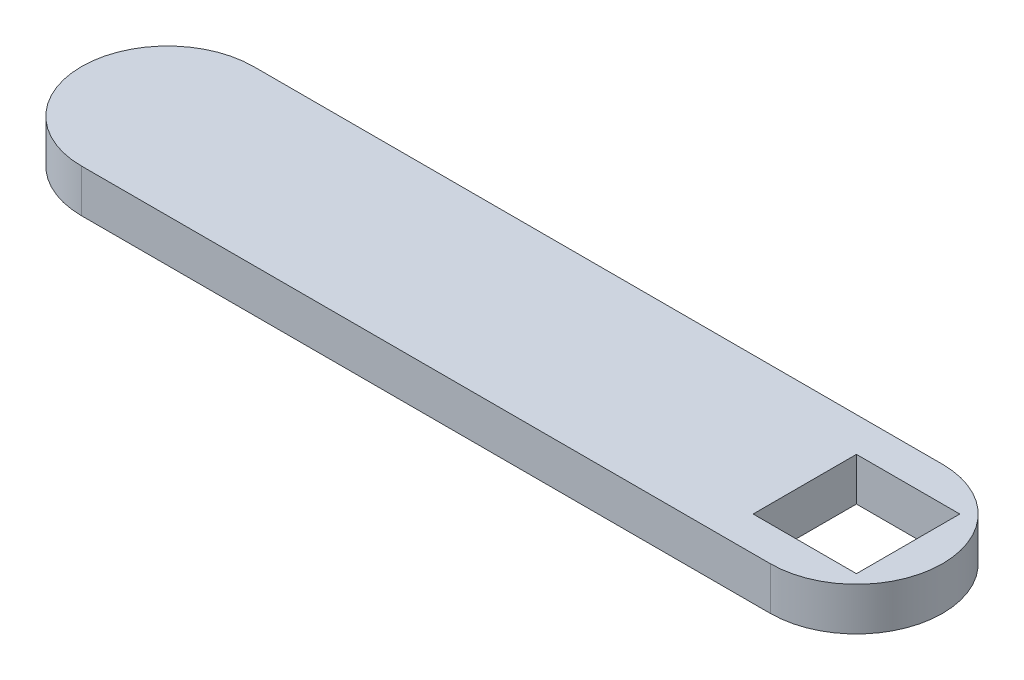
ISO-10303-21;
HEADER;
FILE_DESCRIPTION(('STEP AP214'),'2;1');
FILE_NAME('part.step','',(''),(''),'','','');
FILE_SCHEMA(('AUTOMOTIVE_DESIGN { 1 0 10303 214 1 1 1 1 }'));
ENDSEC;
DATA;
#1=APPLICATION_CONTEXT('core data for automotive mechanical design processes');
#2=APPLICATION_PROTOCOL_DEFINITION('international standard','automotive_design',2000,#1);
#3=PRODUCT_CONTEXT('',#1,'mechanical');
#4=PRODUCT('Part','Part','',(#3));
#5=PRODUCT_RELATED_PRODUCT_CATEGORY('part','',(#4));
#6=PRODUCT_DEFINITION_FORMATION('','',#4);
#7=PRODUCT_DEFINITION_CONTEXT('part definition',#1,'design');
#8=PRODUCT_DEFINITION('design','',#6,#7);
#9=PRODUCT_DEFINITION_SHAPE('','',#8);
#10=(LENGTH_UNIT() NAMED_UNIT(*) SI_UNIT(.MILLI.,.METRE.));
#11=(NAMED_UNIT(*) PLANE_ANGLE_UNIT() SI_UNIT($,.RADIAN.));
#12=(NAMED_UNIT(*) SI_UNIT($,.STERADIAN.) SOLID_ANGLE_UNIT());
#13=UNCERTAINTY_MEASURE_WITH_UNIT(LENGTH_MEASURE(1.E-05),#10,'distance_accuracy_value','');
#14=(GEOMETRIC_REPRESENTATION_CONTEXT(3) GLOBAL_UNCERTAINTY_ASSIGNED_CONTEXT((#13)) GLOBAL_UNIT_ASSIGNED_CONTEXT((#10,
#11,#12)) REPRESENTATION_CONTEXT('',''));
#15=CARTESIAN_POINT('',(0.,0.,0.));
#16=DIRECTION('',(0.,0.,1.));
#17=DIRECTION('',(1.,0.,0.));
#18=AXIS2_PLACEMENT_3D('',#15,#16,#17);
#19=CARTESIAN_POINT('',(0.,25.,0.));
#20=DIRECTION('',(0.,-1.,0.));
#21=DIRECTION('',(0.,0.,-1.));
#22=AXIS2_PLACEMENT_3D('',#19,#20,#21);
#23=CYLINDRICAL_SURFACE('',#22,50.);
#24=CARTESIAN_POINT('',(0.,0.,0.));
#25=DIRECTION('',(0.,1.,0.));
#26=DIRECTION('',(0.,0.,1.));
#27=AXIS2_PLACEMENT_3D('',#24,#25,#26);
#28=CIRCLE('',#27,50.);
#29=CARTESIAN_POINT('',(0.,0.,-50.));
#30=VERTEX_POINT('',#29);
#31=CARTESIAN_POINT('',(0.,0.,50.));
#32=VERTEX_POINT('',#31);
#33=EDGE_CURVE('E151',#30,#32,#28,.T.);
#34=ORIENTED_EDGE('',*,*,#33,.T.);
#35=DIRECTION('',(0.,-1.,0.));
#36=VECTOR('',#35,1.);
#37=CARTESIAN_POINT('',(0.,25.,50.));
#38=LINE('',#37,#36);
#39=CARTESIAN_POINT('',(0.,25.,50.));
#40=VERTEX_POINT('',#39);
#41=EDGE_CURVE('E11',#40,#32,#38,.T.);
#42=ORIENTED_EDGE('',*,*,#41,.F.);
#43=CARTESIAN_POINT('',(0.,25.,0.));
#44=DIRECTION('',(0.,1.,0.));
#45=DIRECTION('',(0.,0.,1.));
#46=AXIS2_PLACEMENT_3D('',#43,#44,#45);
#47=CIRCLE('',#46,50.);
#48=CARTESIAN_POINT('',(0.,25.,-50.));
#49=VERTEX_POINT('',#48);
#50=EDGE_CURVE('E157',#49,#40,#47,.T.);
#51=ORIENTED_EDGE('',*,*,#50,.F.);
#52=DIRECTION('',(0.,-1.,0.));
#53=VECTOR('',#52,1.);
#54=CARTESIAN_POINT('',(0.,25.,-50.));
#55=LINE('',#54,#53);
#56=EDGE_CURVE('E171',#49,#30,#55,.T.);
#57=ORIENTED_EDGE('',*,*,#56,.T.);
#58=EDGE_LOOP('',(#34,#42,#51,#57));
#59=FACE_BOUND('',#58,.T.);
#60=ADVANCED_FACE('F43',(#59),#23,.T.);
#61=CARTESIAN_POINT('',(0.,25.,50.));
#62=DIRECTION('',(0.,0.,-1.));
#63=DIRECTION('',(-1.,0.,0.));
#64=AXIS2_PLACEMENT_3D('',#61,#62,#63);
#65=PLANE('',#64);
#66=DIRECTION('',(1.,0.,0.));
#67=VECTOR('',#66,1.);
#68=CARTESIAN_POINT('',(0.,0.,50.));
#69=LINE('',#68,#67);
#70=CARTESIAN_POINT('',(400.,0.,50.));
#71=VERTEX_POINT('',#70);
#72=EDGE_CURVE('E175',#32,#71,#69,.T.);
#73=ORIENTED_EDGE('',*,*,#72,.T.);
#74=DIRECTION('',(0.,-1.,0.));
#75=VECTOR('',#74,1.);
#76=CARTESIAN_POINT('',(400.,25.,50.));
#77=LINE('',#76,#75);
#78=CARTESIAN_POINT('',(400.,25.,50.));
#79=VERTEX_POINT('',#78);
#80=EDGE_CURVE('E51',#79,#71,#77,.T.);
#81=ORIENTED_EDGE('',*,*,#80,.F.);
#82=DIRECTION('',(1.,0.,0.));
#83=VECTOR('',#82,1.);
#84=CARTESIAN_POINT('',(0.,25.,50.));
#85=LINE('',#84,#83);
#86=EDGE_CURVE('E161',#40,#79,#85,.T.);
#87=ORIENTED_EDGE('',*,*,#86,.F.);
#88=ORIENTED_EDGE('',*,*,#41,.T.);
#89=EDGE_LOOP('',(#73,#81,#87,#88));
#90=FACE_BOUND('',#89,.T.);
#91=ADVANCED_FACE('F209',(#90),#65,.F.);
#92=CARTESIAN_POINT('',(400.,25.,0.));
#93=DIRECTION('',(0.,-1.,0.));
#94=DIRECTION('',(0.,0.,-1.));
#95=AXIS2_PLACEMENT_3D('',#92,#93,#94);
#96=CYLINDRICAL_SURFACE('',#95,50.);
#97=CARTESIAN_POINT('',(400.,0.,0.));
#98=DIRECTION('',(0.,1.,0.));
#99=DIRECTION('',(0.,0.,1.));
#100=AXIS2_PLACEMENT_3D('',#97,#98,#99);
#101=CIRCLE('',#100,50.);
#102=CARTESIAN_POINT('',(400.,0.,-50.));
#103=VERTEX_POINT('',#102);
#104=EDGE_CURVE('E178',#71,#103,#101,.T.);
#105=ORIENTED_EDGE('',*,*,#104,.T.);
#106=DIRECTION('',(0.,-1.,0.));
#107=VECTOR('',#106,1.);
#108=CARTESIAN_POINT('',(400.,25.,-50.));
#109=LINE('',#108,#107);
#110=CARTESIAN_POINT('',(400.,25.,-50.));
#111=VERTEX_POINT('',#110);
#112=EDGE_CURVE('E186',#111,#103,#109,.T.);
#113=ORIENTED_EDGE('',*,*,#112,.F.);
#114=CARTESIAN_POINT('',(400.,25.,0.));
#115=DIRECTION('',(0.,1.,0.));
#116=DIRECTION('',(0.,0.,1.));
#117=AXIS2_PLACEMENT_3D('',#114,#115,#116);
#118=CIRCLE('',#117,50.);
#119=EDGE_CURVE('E165',#79,#111,#118,.T.);
#120=ORIENTED_EDGE('',*,*,#119,.F.);
#121=ORIENTED_EDGE('',*,*,#80,.T.);
#122=EDGE_LOOP('',(#105,#113,#120,#121));
#123=FACE_BOUND('',#122,.T.);
#124=ADVANCED_FACE('F195',(#123),#96,.T.);
#125=CARTESIAN_POINT('',(0.,25.,-50.));
#126=DIRECTION('',(0.,0.,1.));
#127=DIRECTION('',(1.,0.,0.));
#128=AXIS2_PLACEMENT_3D('',#125,#126,#127);
#129=PLANE('',#128);
#130=DIRECTION('',(-1.,0.,0.));
#131=VECTOR('',#130,1.);
#132=CARTESIAN_POINT('',(0.,0.,-50.));
#133=LINE('',#132,#131);
#134=EDGE_CURVE('E162',#103,#30,#133,.T.);
#135=ORIENTED_EDGE('',*,*,#134,.T.);
#136=ORIENTED_EDGE('',*,*,#56,.F.);
#137=DIRECTION('',(-1.,0.,0.));
#138=VECTOR('',#137,1.);
#139=CARTESIAN_POINT('',(0.,25.,-50.));
#140=LINE('',#139,#138);
#141=EDGE_CURVE('E168',#111,#49,#140,.T.);
#142=ORIENTED_EDGE('',*,*,#141,.F.);
#143=ORIENTED_EDGE('',*,*,#112,.T.);
#144=EDGE_LOOP('',(#135,#136,#142,#143));
#145=FACE_BOUND('',#144,.T.);
#146=ADVANCED_FACE('F202',(#145),#129,.F.);
#147=CARTESIAN_POINT('',(0.,25.,0.));
#148=DIRECTION('',(0.,1.,0.));
#149=DIRECTION('',(0.,0.,1.));
#150=AXIS2_PLACEMENT_3D('',#147,#148,#149);
#151=PLANE('',#150);
#152=DIRECTION('',(0.,0.,-1.));
#153=VECTOR('',#152,1.);
#154=CARTESIAN_POINT('',(430.,25.,30.));
#155=LINE('',#154,#153);
#156=CARTESIAN_POINT('',(430.,25.,30.));
#157=VERTEX_POINT('',#156);
#158=CARTESIAN_POINT('',(430.,25.,-30.));
#159=VERTEX_POINT('',#158);
#160=EDGE_CURVE('E58',#157,#159,#155,.T.);
#161=ORIENTED_EDGE('',*,*,#160,.F.);
#162=DIRECTION('',(1.,0.,0.));
#163=VECTOR('',#162,1.);
#164=CARTESIAN_POINT('',(370.,25.,30.));
#165=LINE('',#164,#163);
#166=CARTESIAN_POINT('',(370.,25.,30.));
#167=VERTEX_POINT('',#166);
#168=EDGE_CURVE('E129',#167,#157,#165,.T.);
#169=ORIENTED_EDGE('',*,*,#168,.F.);
#170=DIRECTION('',(0.,0.,1.));
#171=VECTOR('',#170,1.);
#172=CARTESIAN_POINT('',(370.,25.,30.));
#173=LINE('',#172,#171);
#174=CARTESIAN_POINT('',(370.,25.,-30.));
#175=VERTEX_POINT('',#174);
#176=EDGE_CURVE('E133',#175,#167,#173,.T.);
#177=ORIENTED_EDGE('',*,*,#176,.F.);
#178=DIRECTION('',(-1.,0.,0.));
#179=VECTOR('',#178,1.);
#180=CARTESIAN_POINT('',(370.,25.,-30.));
#181=LINE('',#180,#179);
#182=EDGE_CURVE('E142',#159,#175,#181,.T.);
#183=ORIENTED_EDGE('',*,*,#182,.F.);
#184=EDGE_LOOP('',(#161,#169,#177,#183));
#185=FACE_BOUND('',#184,.T.);
#186=ORIENTED_EDGE('',*,*,#50,.T.);
#187=ORIENTED_EDGE('',*,*,#86,.T.);
#188=ORIENTED_EDGE('',*,*,#119,.T.);
#189=ORIENTED_EDGE('',*,*,#141,.T.);
#190=EDGE_LOOP('',(#186,#187,#188,#189));
#191=FACE_BOUND('',#190,.T.);
#192=ADVANCED_FACE('F208',(#185,#191),#151,.T.);
#193=CARTESIAN_POINT('',(0.,0.,0.));
#194=DIRECTION('',(0.,1.,0.));
#195=DIRECTION('',(0.,0.,1.));
#196=AXIS2_PLACEMENT_3D('',#193,#194,#195);
#197=PLANE('',#196);
#198=DIRECTION('',(1.,0.,0.));
#199=VECTOR('',#198,1.);
#200=CARTESIAN_POINT('',(370.,0.,30.));
#201=LINE('',#200,#199);
#202=CARTESIAN_POINT('',(370.,0.,30.));
#203=VERTEX_POINT('',#202);
#204=CARTESIAN_POINT('',(430.,0.,30.));
#205=VERTEX_POINT('',#204);
#206=EDGE_CURVE('E117',#203,#205,#201,.T.);
#207=ORIENTED_EDGE('',*,*,#206,.T.);
#208=DIRECTION('',(0.,0.,-1.));
#209=VECTOR('',#208,1.);
#210=CARTESIAN_POINT('',(430.,0.,30.));
#211=LINE('',#210,#209);
#212=CARTESIAN_POINT('',(430.,0.,-30.));
#213=VERTEX_POINT('',#212);
#214=EDGE_CURVE('E110',#205,#213,#211,.T.);
#215=ORIENTED_EDGE('',*,*,#214,.T.);
#216=DIRECTION('',(-1.,0.,0.));
#217=VECTOR('',#216,1.);
#218=CARTESIAN_POINT('',(370.,0.,-30.));
#219=LINE('',#218,#217);
#220=CARTESIAN_POINT('',(370.,0.,-30.));
#221=VERTEX_POINT('',#220);
#222=EDGE_CURVE('E120',#213,#221,#219,.T.);
#223=ORIENTED_EDGE('',*,*,#222,.T.);
#224=DIRECTION('',(0.,0.,1.));
#225=VECTOR('',#224,1.);
#226=CARTESIAN_POINT('',(370.,0.,30.));
#227=LINE('',#226,#225);
#228=EDGE_CURVE('E66',#221,#203,#227,.T.);
#229=ORIENTED_EDGE('',*,*,#228,.T.);
#230=EDGE_LOOP('',(#207,#215,#223,#229));
#231=FACE_BOUND('',#230,.T.);
#232=ORIENTED_EDGE('',*,*,#33,.F.);
#233=ORIENTED_EDGE('',*,*,#134,.F.);
#234=ORIENTED_EDGE('',*,*,#104,.F.);
#235=ORIENTED_EDGE('',*,*,#72,.F.);
#236=EDGE_LOOP('',(#232,#233,#234,#235));
#237=FACE_BOUND('',#236,.T.);
#238=ADVANCED_FACE('F125',(#231,#237),#197,.F.);
#239=CARTESIAN_POINT('',(430.,0.,30.));
#240=DIRECTION('',(1.,0.,0.));
#241=DIRECTION('',(0.,0.,-1.));
#242=AXIS2_PLACEMENT_3D('',#239,#240,#241);
#243=PLANE('',#242);
#244=ORIENTED_EDGE('',*,*,#160,.T.);
#245=DIRECTION('',(0.,1.,0.));
#246=VECTOR('',#245,1.);
#247=CARTESIAN_POINT('',(430.,0.,-30.));
#248=LINE('',#247,#246);
#249=EDGE_CURVE('E106',#213,#159,#248,.T.);
#250=ORIENTED_EDGE('',*,*,#249,.F.);
#251=ORIENTED_EDGE('',*,*,#214,.F.);
#252=DIRECTION('',(0.,1.,0.));
#253=VECTOR('',#252,1.);
#254=CARTESIAN_POINT('',(430.,0.,30.));
#255=LINE('',#254,#253);
#256=EDGE_CURVE('E148',#205,#157,#255,.T.);
#257=ORIENTED_EDGE('',*,*,#256,.T.);
#258=EDGE_LOOP('',(#244,#250,#251,#257));
#259=FACE_BOUND('',#258,.T.);
#260=ADVANCED_FACE('F108',(#259),#243,.F.);
#261=CARTESIAN_POINT('',(370.,0.,30.));
#262=DIRECTION('',(0.,0.,1.));
#263=DIRECTION('',(1.,0.,0.));
#264=AXIS2_PLACEMENT_3D('',#261,#262,#263);
#265=PLANE('',#264);
#266=ORIENTED_EDGE('',*,*,#168,.T.);
#267=ORIENTED_EDGE('',*,*,#256,.F.);
#268=ORIENTED_EDGE('',*,*,#206,.F.);
#269=DIRECTION('',(0.,1.,0.));
#270=VECTOR('',#269,1.);
#271=CARTESIAN_POINT('',(370.,0.,30.));
#272=LINE('',#271,#270);
#273=EDGE_CURVE('E152',#203,#167,#272,.T.);
#274=ORIENTED_EDGE('',*,*,#273,.T.);
#275=EDGE_LOOP('',(#266,#267,#268,#274));
#276=FACE_BOUND('',#275,.T.);
#277=ADVANCED_FACE('F226',(#276),#265,.F.);
#278=CARTESIAN_POINT('',(370.,0.,30.));
#279=DIRECTION('',(-1.,0.,0.));
#280=DIRECTION('',(0.,0.,1.));
#281=AXIS2_PLACEMENT_3D('',#278,#279,#280);
#282=PLANE('',#281);
#283=ORIENTED_EDGE('',*,*,#176,.T.);
#284=ORIENTED_EDGE('',*,*,#273,.F.);
#285=ORIENTED_EDGE('',*,*,#228,.F.);
#286=DIRECTION('',(0.,1.,0.));
#287=VECTOR('',#286,1.);
#288=CARTESIAN_POINT('',(370.,0.,-30.));
#289=LINE('',#288,#287);
#290=EDGE_CURVE('E116',#221,#175,#289,.T.);
#291=ORIENTED_EDGE('',*,*,#290,.T.);
#292=EDGE_LOOP('',(#283,#284,#285,#291));
#293=FACE_BOUND('',#292,.T.);
#294=ADVANCED_FACE('F229',(#293),#282,.F.);
#295=CARTESIAN_POINT('',(370.,0.,-30.));
#296=DIRECTION('',(0.,0.,-1.));
#297=DIRECTION('',(-1.,0.,0.));
#298=AXIS2_PLACEMENT_3D('',#295,#296,#297);
#299=PLANE('',#298);
#300=ORIENTED_EDGE('',*,*,#182,.T.);
#301=ORIENTED_EDGE('',*,*,#290,.F.);
#302=ORIENTED_EDGE('',*,*,#222,.F.);
#303=ORIENTED_EDGE('',*,*,#249,.T.);
#304=EDGE_LOOP('',(#300,#301,#302,#303));
#305=FACE_BOUND('',#304,.T.);
#306=ADVANCED_FACE('F121',(#305),#299,.F.);
#307=CLOSED_SHELL('',(#60,#91,#124,#146,#192,#238,#260,#277,#294,#306));
#308=MANIFOLD_SOLID_BREP('B2',#307);
#309=ADVANCED_BREP_SHAPE_REPRESENTATION('',(#18,#308),#14);
#310=SHAPE_DEFINITION_REPRESENTATION(#9,#309);
ENDSEC;
END-ISO-10303-21;
